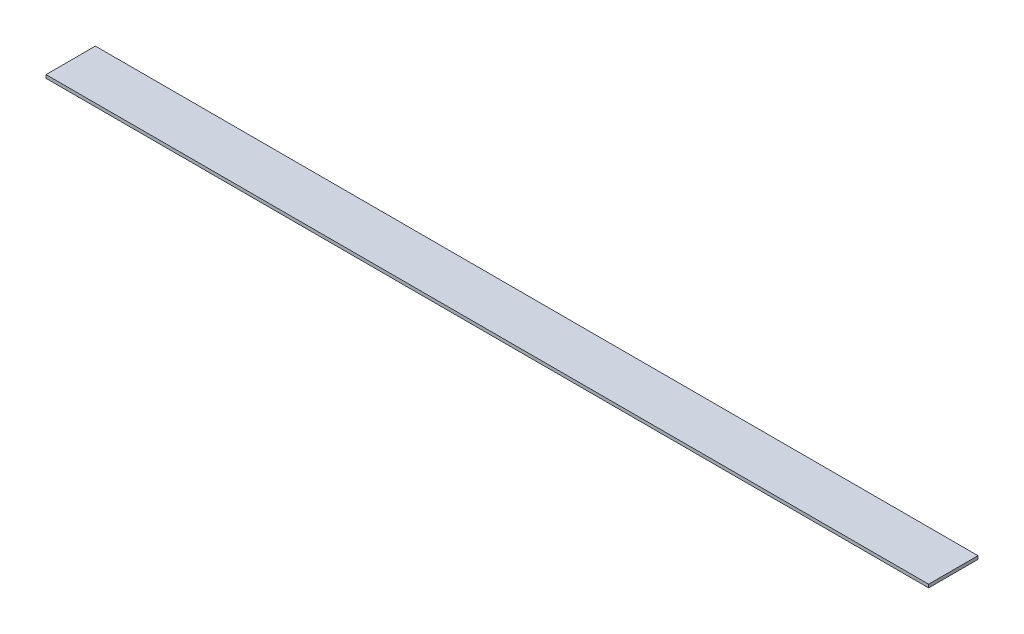
ISO-10303-21;
HEADER;
FILE_DESCRIPTION(('STEP AP214'),'2;1');
FILE_NAME('part.step','',(''),(''),'','','');
FILE_SCHEMA(('AUTOMOTIVE_DESIGN { 1 0 10303 214 1 1 1 1 }'));
ENDSEC;
DATA;
#1=APPLICATION_CONTEXT('core data for automotive mechanical design processes');
#2=APPLICATION_PROTOCOL_DEFINITION('international standard','automotive_design',2000,#1);
#3=PRODUCT_CONTEXT('',#1,'mechanical');
#4=PRODUCT('Part','Part','',(#3));
#5=PRODUCT_RELATED_PRODUCT_CATEGORY('part','',(#4));
#6=PRODUCT_DEFINITION_FORMATION('','',#4);
#7=PRODUCT_DEFINITION_CONTEXT('part definition',#1,'design');
#8=PRODUCT_DEFINITION('design','',#6,#7);
#9=PRODUCT_DEFINITION_SHAPE('','',#8);
#10=(LENGTH_UNIT() NAMED_UNIT(*) SI_UNIT(.MILLI.,.METRE.));
#11=(NAMED_UNIT(*) PLANE_ANGLE_UNIT() SI_UNIT($,.RADIAN.));
#12=(NAMED_UNIT(*) SI_UNIT($,.STERADIAN.) SOLID_ANGLE_UNIT());
#13=UNCERTAINTY_MEASURE_WITH_UNIT(LENGTH_MEASURE(1.E-05),#10,'distance_accuracy_value','');
#14=(GEOMETRIC_REPRESENTATION_CONTEXT(3) GLOBAL_UNCERTAINTY_ASSIGNED_CONTEXT((#13)) GLOBAL_UNIT_ASSIGNED_CONTEXT((#10,
#11,#12)) REPRESENTATION_CONTEXT('',''));
#15=CARTESIAN_POINT('',(0.,0.,0.));
#16=DIRECTION('',(0.,0.,1.));
#17=DIRECTION('',(1.,0.,0.));
#18=AXIS2_PLACEMENT_3D('',#15,#16,#17);
#19=CARTESIAN_POINT('',(0.,-0.8382,0.));
#20=DIRECTION('',(-1.,0.,0.));
#21=DIRECTION('',(0.,0.,1.));
#22=AXIS2_PLACEMENT_3D('',#19,#20,#21);
#23=PLANE('',#22);
#24=DIRECTION('',(0.,0.,1.));
#25=VECTOR('',#24,1.);
#26=CARTESIAN_POINT('',(0.,0.,0.));
#27=LINE('',#26,#25);
#28=CARTESIAN_POINT('',(0.,0.,0.));
#29=VERTEX_POINT('',#28);
#30=CARTESIAN_POINT('',(0.,0.,12.7));
#31=VERTEX_POINT('',#30);
#32=EDGE_CURVE('E99',#29,#31,#27,.T.);
#33=ORIENTED_EDGE('',*,*,#32,.F.);
#34=DIRECTION('',(0.,1.,0.));
#35=VECTOR('',#34,1.);
#36=CARTESIAN_POINT('',(0.,-0.8382,0.));
#37=LINE('',#36,#35);
#38=CARTESIAN_POINT('',(0.,-0.8382,0.));
#39=VERTEX_POINT('',#38);
#40=EDGE_CURVE('E11',#39,#29,#37,.T.);
#41=ORIENTED_EDGE('',*,*,#40,.F.);
#42=DIRECTION('',(0.,0.,1.));
#43=VECTOR('',#42,1.);
#44=CARTESIAN_POINT('',(0.,-0.8382,0.));
#45=LINE('',#44,#43);
#46=CARTESIAN_POINT('',(0.,-0.8382,12.7));
#47=VERTEX_POINT('',#46);
#48=EDGE_CURVE('E93',#39,#47,#45,.T.);
#49=ORIENTED_EDGE('',*,*,#48,.T.);
#50=DIRECTION('',(0.,1.,0.));
#51=VECTOR('',#50,1.);
#52=CARTESIAN_POINT('',(0.,-0.8382,12.7));
#53=LINE('',#52,#51);
#54=EDGE_CURVE('E38',#47,#31,#53,.T.);
#55=ORIENTED_EDGE('',*,*,#54,.T.);
#56=EDGE_LOOP('',(#33,#41,#49,#55));
#57=FACE_BOUND('',#56,.T.);
#58=ADVANCED_FACE('F35',(#57),#23,.T.);
#59=CARTESIAN_POINT('',(0.,-0.8382,0.));
#60=DIRECTION('',(0.,0.,-1.));
#61=DIRECTION('',(-1.,0.,0.));
#62=AXIS2_PLACEMENT_3D('',#59,#60,#61);
#63=PLANE('',#62);
#64=DIRECTION('',(-1.,0.,0.));
#65=VECTOR('',#64,1.);
#66=CARTESIAN_POINT('',(0.,0.,0.));
#67=LINE('',#66,#65);
#68=CARTESIAN_POINT('',(227.,0.,0.));
#69=VERTEX_POINT('',#68);
#70=EDGE_CURVE('E95',#69,#29,#67,.T.);
#71=ORIENTED_EDGE('',*,*,#70,.F.);
#72=DIRECTION('',(0.,1.,0.));
#73=VECTOR('',#72,1.);
#74=CARTESIAN_POINT('',(227.,-0.8382,0.));
#75=LINE('',#74,#73);
#76=CARTESIAN_POINT('',(227.,-0.8382,0.));
#77=VERTEX_POINT('',#76);
#78=EDGE_CURVE('E44',#77,#69,#75,.T.);
#79=ORIENTED_EDGE('',*,*,#78,.F.);
#80=DIRECTION('',(-1.,0.,0.));
#81=VECTOR('',#80,1.);
#82=CARTESIAN_POINT('',(0.,-0.8382,0.));
#83=LINE('',#82,#81);
#84=EDGE_CURVE('E90',#77,#39,#83,.T.);
#85=ORIENTED_EDGE('',*,*,#84,.T.);
#86=ORIENTED_EDGE('',*,*,#40,.T.);
#87=EDGE_LOOP('',(#71,#79,#85,#86));
#88=FACE_BOUND('',#87,.T.);
#89=ADVANCED_FACE('F109',(#88),#63,.T.);
#90=CARTESIAN_POINT('',(227.,-0.8382,0.));
#91=DIRECTION('',(1.,0.,0.));
#92=DIRECTION('',(0.,0.,-1.));
#93=AXIS2_PLACEMENT_3D('',#90,#91,#92);
#94=PLANE('',#93);
#95=DIRECTION('',(0.,0.,-1.));
#96=VECTOR('',#95,1.);
#97=CARTESIAN_POINT('',(227.,0.,0.));
#98=LINE('',#97,#96);
#99=CARTESIAN_POINT('',(227.,0.,12.7));
#100=VERTEX_POINT('',#99);
#101=EDGE_CURVE('E85',#100,#69,#98,.T.);
#102=ORIENTED_EDGE('',*,*,#101,.F.);
#103=DIRECTION('',(0.,1.,0.));
#104=VECTOR('',#103,1.);
#105=CARTESIAN_POINT('',(227.,-0.8382,12.7));
#106=LINE('',#105,#104);
#107=CARTESIAN_POINT('',(227.,-0.8382,12.7));
#108=VERTEX_POINT('',#107);
#109=EDGE_CURVE('E80',#108,#100,#106,.T.);
#110=ORIENTED_EDGE('',*,*,#109,.F.);
#111=DIRECTION('',(0.,0.,-1.));
#112=VECTOR('',#111,1.);
#113=CARTESIAN_POINT('',(227.,-0.8382,0.));
#114=LINE('',#113,#112);
#115=EDGE_CURVE('E83',#108,#77,#114,.T.);
#116=ORIENTED_EDGE('',*,*,#115,.T.);
#117=ORIENTED_EDGE('',*,*,#78,.T.);
#118=EDGE_LOOP('',(#102,#110,#116,#117));
#119=FACE_BOUND('',#118,.T.);
#120=ADVANCED_FACE('F82',(#119),#94,.T.);
#121=CARTESIAN_POINT('',(0.,-0.8382,12.7));
#122=DIRECTION('',(0.,0.,1.));
#123=DIRECTION('',(1.,0.,0.));
#124=AXIS2_PLACEMENT_3D('',#121,#122,#123);
#125=PLANE('',#124);
#126=DIRECTION('',(1.,0.,0.));
#127=VECTOR('',#126,1.);
#128=CARTESIAN_POINT('',(0.,0.,12.7));
#129=LINE('',#128,#127);
#130=EDGE_CURVE('E102',#31,#100,#129,.T.);
#131=ORIENTED_EDGE('',*,*,#130,.F.);
#132=ORIENTED_EDGE('',*,*,#54,.F.);
#133=DIRECTION('',(1.,0.,0.));
#134=VECTOR('',#133,1.);
#135=CARTESIAN_POINT('',(0.,-0.8382,12.7));
#136=LINE('',#135,#134);
#137=EDGE_CURVE('E89',#47,#108,#136,.T.);
#138=ORIENTED_EDGE('',*,*,#137,.T.);
#139=ORIENTED_EDGE('',*,*,#109,.T.);
#140=EDGE_LOOP('',(#131,#132,#138,#139));
#141=FACE_BOUND('',#140,.T.);
#142=ADVANCED_FACE('F92',(#141),#125,.T.);
#143=CARTESIAN_POINT('',(0.,-0.8382,0.));
#144=DIRECTION('',(0.,1.,0.));
#145=DIRECTION('',(0.,0.,1.));
#146=AXIS2_PLACEMENT_3D('',#143,#144,#145);
#147=PLANE('',#146);
#148=ORIENTED_EDGE('',*,*,#48,.F.);
#149=ORIENTED_EDGE('',*,*,#84,.F.);
#150=ORIENTED_EDGE('',*,*,#115,.F.);
#151=ORIENTED_EDGE('',*,*,#137,.F.);
#152=EDGE_LOOP('',(#148,#149,#150,#151));
#153=FACE_BOUND('',#152,.T.);
#154=ADVANCED_FACE('F88',(#153),#147,.F.);
#155=CARTESIAN_POINT('',(0.,0.,0.));
#156=DIRECTION('',(0.,1.,0.));
#157=DIRECTION('',(0.,0.,1.));
#158=AXIS2_PLACEMENT_3D('',#155,#156,#157);
#159=PLANE('',#158);
#160=ORIENTED_EDGE('',*,*,#32,.T.);
#161=ORIENTED_EDGE('',*,*,#130,.T.);
#162=ORIENTED_EDGE('',*,*,#101,.T.);
#163=ORIENTED_EDGE('',*,*,#70,.T.);
#164=EDGE_LOOP('',(#160,#161,#162,#163));
#165=FACE_BOUND('',#164,.T.);
#166=ADVANCED_FACE('F108',(#165),#159,.T.);
#167=CLOSED_SHELL('',(#58,#89,#120,#142,#154,#166));
#168=MANIFOLD_SOLID_BREP('B2',#167);
#169=ADVANCED_BREP_SHAPE_REPRESENTATION('',(#18,#168),#14);
#170=SHAPE_DEFINITION_REPRESENTATION(#9,#169);
ENDSEC;
END-ISO-10303-21;
